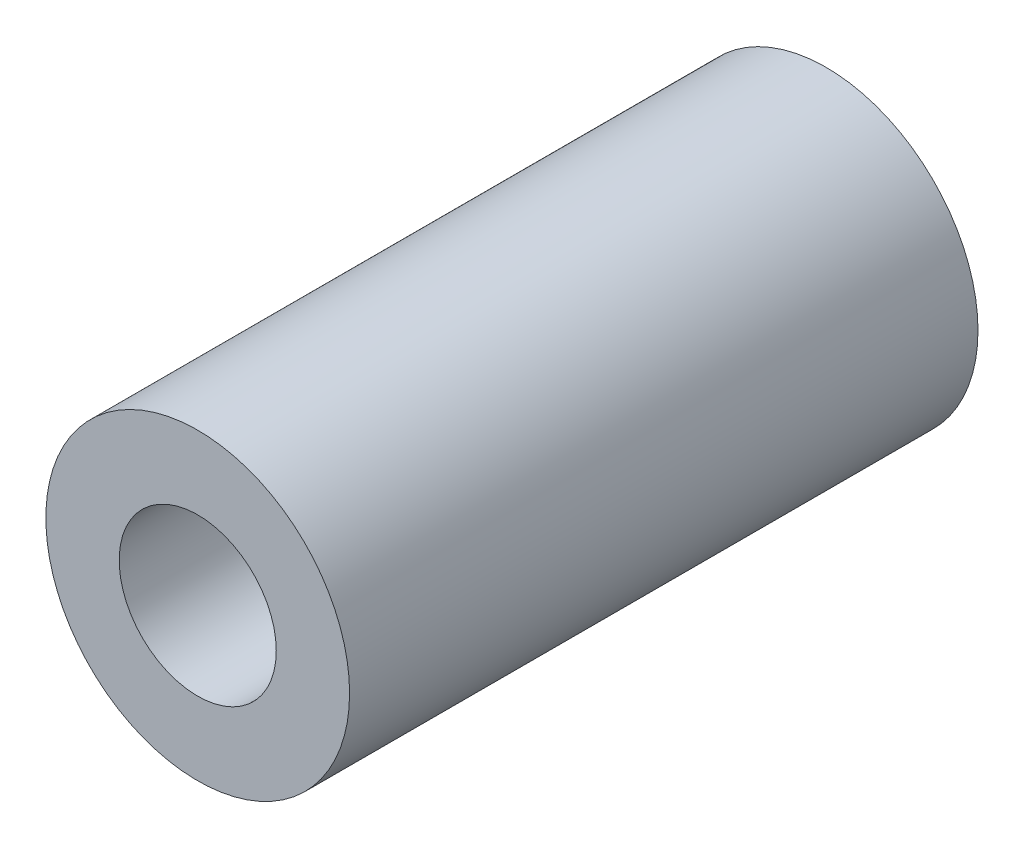
ISO-10303-21;
HEADER;
FILE_DESCRIPTION(('STEP AP214'),'2;1');
FILE_NAME('part.step','',(''),(''),'','','');
FILE_SCHEMA(('AUTOMOTIVE_DESIGN { 1 0 10303 214 1 1 1 1 }'));
ENDSEC;
DATA;
#1=APPLICATION_CONTEXT('core data for automotive mechanical design processes');
#2=APPLICATION_PROTOCOL_DEFINITION('international standard','automotive_design',2000,#1);
#3=PRODUCT_CONTEXT('',#1,'mechanical');
#4=PRODUCT('Part','Part','',(#3));
#5=PRODUCT_RELATED_PRODUCT_CATEGORY('part','',(#4));
#6=PRODUCT_DEFINITION_FORMATION('','',#4);
#7=PRODUCT_DEFINITION_CONTEXT('part definition',#1,'design');
#8=PRODUCT_DEFINITION('design','',#6,#7);
#9=PRODUCT_DEFINITION_SHAPE('','',#8);
#10=(LENGTH_UNIT() NAMED_UNIT(*) SI_UNIT(.MILLI.,.METRE.));
#11=(NAMED_UNIT(*) PLANE_ANGLE_UNIT() SI_UNIT($,.RADIAN.));
#12=(NAMED_UNIT(*) SI_UNIT($,.STERADIAN.) SOLID_ANGLE_UNIT());
#13=UNCERTAINTY_MEASURE_WITH_UNIT(LENGTH_MEASURE(1.E-05),#10,'distance_accuracy_value','');
#14=(GEOMETRIC_REPRESENTATION_CONTEXT(3) GLOBAL_UNCERTAINTY_ASSIGNED_CONTEXT((#13)) GLOBAL_UNIT_ASSIGNED_CONTEXT((#10,
#11,#12)) REPRESENTATION_CONTEXT('',''));
#15=CARTESIAN_POINT('',(0.,0.,0.));
#16=DIRECTION('',(0.,0.,1.));
#17=DIRECTION('',(1.,0.,0.));
#18=AXIS2_PLACEMENT_3D('',#15,#16,#17);
#19=CARTESIAN_POINT('',(0.,0.,12.));
#20=DIRECTION('',(0.,0.,1.));
#21=DIRECTION('',(1.,0.,0.));
#22=AXIS2_PLACEMENT_3D('',#19,#20,#21);
#23=PLANE('',#22);
#24=CARTESIAN_POINT('',(0.,0.,12.));
#25=DIRECTION('',(0.,0.,1.));
#26=DIRECTION('',(1.,0.,0.));
#27=AXIS2_PLACEMENT_3D('',#24,#25,#26);
#28=CIRCLE('',#27,2.9);
#29=CARTESIAN_POINT('',(2.9,0.,12.));
#30=VERTEX_POINT('',#29);
#31=EDGE_CURVE('E10',#30,#30,#28,.T.);
#32=ORIENTED_EDGE('',*,*,#31,.T.);
#33=EDGE_LOOP('',(#32));
#34=FACE_BOUND('',#33,.T.);
#35=CARTESIAN_POINT('',(0.,0.,12.));
#36=DIRECTION('',(0.,0.,1.));
#37=DIRECTION('',(1.,0.,0.));
#38=AXIS2_PLACEMENT_3D('',#35,#36,#37);
#39=CIRCLE('',#38,1.5);
#40=CARTESIAN_POINT('',(1.5,0.,12.));
#41=VERTEX_POINT('',#40);
#42=EDGE_CURVE('E42',#41,#41,#39,.T.);
#43=ORIENTED_EDGE('',*,*,#42,.F.);
#44=EDGE_LOOP('',(#43));
#45=FACE_BOUND('',#44,.T.);
#46=ADVANCED_FACE('F31',(#34,#45),#23,.T.);
#47=CARTESIAN_POINT('',(0.,0.,0.));
#48=DIRECTION('',(0.,0.,1.));
#49=DIRECTION('',(1.,0.,0.));
#50=AXIS2_PLACEMENT_3D('',#47,#48,#49);
#51=PLANE('',#50);
#52=CARTESIAN_POINT('',(0.,0.,0.));
#53=DIRECTION('',(0.,0.,1.));
#54=DIRECTION('',(1.,0.,0.));
#55=AXIS2_PLACEMENT_3D('',#52,#53,#54);
#56=CIRCLE('',#55,2.9);
#57=CARTESIAN_POINT('',(2.9,0.,0.));
#58=VERTEX_POINT('',#57);
#59=EDGE_CURVE('E35',#58,#58,#56,.T.);
#60=ORIENTED_EDGE('',*,*,#59,.F.);
#61=EDGE_LOOP('',(#60));
#62=FACE_BOUND('',#61,.T.);
#63=CARTESIAN_POINT('',(0.,0.,0.));
#64=DIRECTION('',(0.,0.,1.));
#65=DIRECTION('',(1.,0.,0.));
#66=AXIS2_PLACEMENT_3D('',#63,#64,#65);
#67=CIRCLE('',#66,1.5);
#68=CARTESIAN_POINT('',(1.5,0.,0.));
#69=VERTEX_POINT('',#68);
#70=EDGE_CURVE('E44',#69,#69,#67,.T.);
#71=ORIENTED_EDGE('',*,*,#70,.T.);
#72=EDGE_LOOP('',(#71));
#73=FACE_BOUND('',#72,.T.);
#74=ADVANCED_FACE('F54',(#62,#73),#51,.F.);
#75=CARTESIAN_POINT('',(0.,0.,12.));
#76=DIRECTION('',(0.,0.,-1.));
#77=DIRECTION('',(-1.,0.,0.));
#78=AXIS2_PLACEMENT_3D('',#75,#76,#77);
#79=CYLINDRICAL_SURFACE('',#78,2.9);
#80=ORIENTED_EDGE('',*,*,#31,.F.);
#81=EDGE_LOOP('',(#80));
#82=FACE_BOUND('',#81,.T.);
#83=ORIENTED_EDGE('',*,*,#59,.T.);
#84=EDGE_LOOP('',(#83));
#85=FACE_BOUND('',#84,.T.);
#86=ADVANCED_FACE('F33',(#82,#85),#79,.T.);
#87=CARTESIAN_POINT('',(0.,0.,12.));
#88=DIRECTION('',(0.,0.,-1.));
#89=DIRECTION('',(-1.,0.,0.));
#90=AXIS2_PLACEMENT_3D('',#87,#88,#89);
#91=CYLINDRICAL_SURFACE('',#90,1.5);
#92=ORIENTED_EDGE('',*,*,#42,.T.);
#93=EDGE_LOOP('',(#92));
#94=FACE_BOUND('',#93,.T.);
#95=ORIENTED_EDGE('',*,*,#70,.F.);
#96=EDGE_LOOP('',(#95));
#97=FACE_BOUND('',#96,.T.);
#98=ADVANCED_FACE('F50',(#94,#97),#91,.F.);
#99=CLOSED_SHELL('',(#46,#74,#86,#98));
#100=MANIFOLD_SOLID_BREP('B2',#99);
#101=ADVANCED_BREP_SHAPE_REPRESENTATION('',(#18,#100),#14);
#102=SHAPE_DEFINITION_REPRESENTATION(#9,#101);
ENDSEC;
END-ISO-10303-21;
